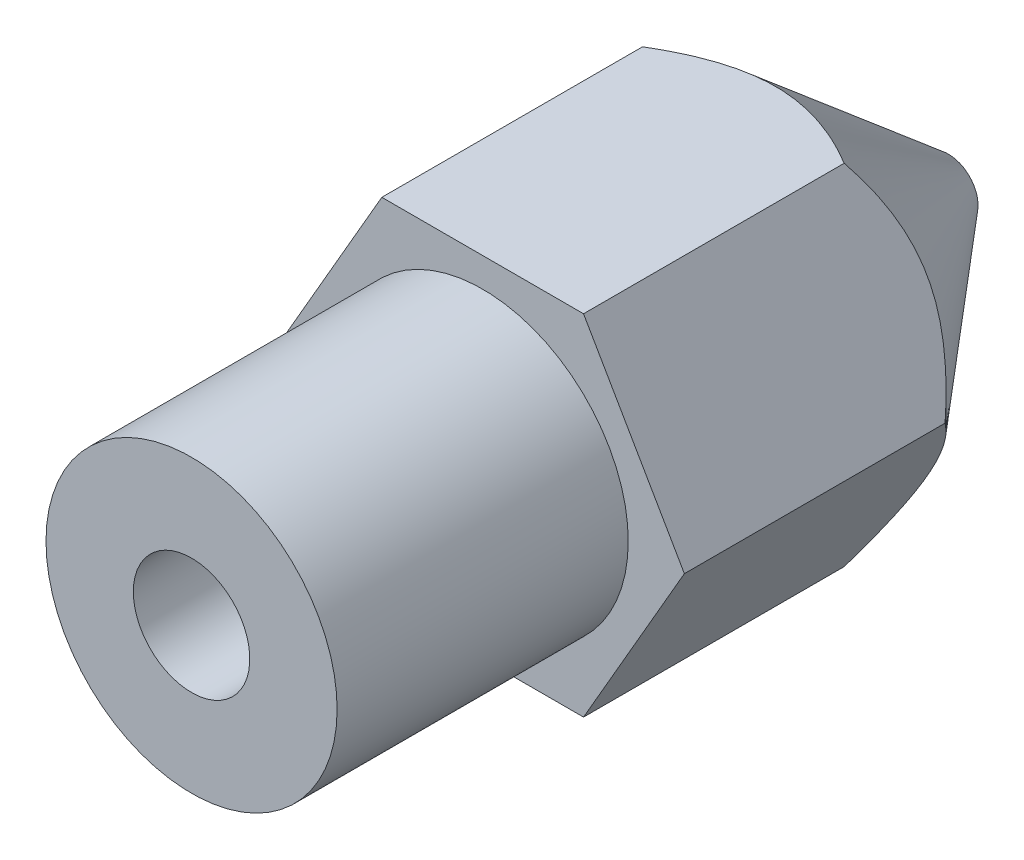
ISO-10303-21;
HEADER;
FILE_DESCRIPTION(('STEP AP214'),'2;1');
FILE_NAME('part.step','',(''),(''),'','','');
FILE_SCHEMA(('AUTOMOTIVE_DESIGN { 1 0 10303 214 1 1 1 1 }'));
ENDSEC;
DATA;
#1=APPLICATION_CONTEXT('core data for automotive mechanical design processes');
#2=APPLICATION_PROTOCOL_DEFINITION('international standard','automotive_design',2000,#1);
#3=PRODUCT_CONTEXT('',#1,'mechanical');
#4=PRODUCT('Part','Part','',(#3));
#5=PRODUCT_RELATED_PRODUCT_CATEGORY('part','',(#4));
#6=PRODUCT_DEFINITION_FORMATION('','',#4);
#7=PRODUCT_DEFINITION_CONTEXT('part definition',#1,'design');
#8=PRODUCT_DEFINITION('design','',#6,#7);
#9=PRODUCT_DEFINITION_SHAPE('','',#8);
#10=(LENGTH_UNIT() NAMED_UNIT(*) SI_UNIT(.MILLI.,.METRE.));
#11=(NAMED_UNIT(*) PLANE_ANGLE_UNIT() SI_UNIT($,.RADIAN.));
#12=(NAMED_UNIT(*) SI_UNIT($,.STERADIAN.) SOLID_ANGLE_UNIT());
#13=UNCERTAINTY_MEASURE_WITH_UNIT(LENGTH_MEASURE(1.E-05),#10,'distance_accuracy_value','');
#14=(GEOMETRIC_REPRESENTATION_CONTEXT(3) GLOBAL_UNCERTAINTY_ASSIGNED_CONTEXT((#13)) GLOBAL_UNIT_ASSIGNED_CONTEXT((#10,
#11,#12)) REPRESENTATION_CONTEXT('',''));
#15=CARTESIAN_POINT('',(0.,0.,0.));
#16=DIRECTION('',(0.,0.,1.));
#17=DIRECTION('',(1.,0.,0.));
#18=AXIS2_PLACEMENT_3D('',#15,#16,#17);
#19=CARTESIAN_POINT('',(1.73205080756888,3.,8.));
#20=DIRECTION('',(0.,0.,1.));
#21=DIRECTION('',(1.,0.,0.));
#22=AXIS2_PLACEMENT_3D('',#19,#20,#21);
#23=PLANE('',#22);
#24=DIRECTION('',(-0.5,0.866025403784438,0.));
#25=VECTOR('',#24,1.);
#26=CARTESIAN_POINT('',(3.46410161513776,0.,8.));
#27=LINE('',#26,#25);
#28=CARTESIAN_POINT('',(3.46410161513776,0.,8.));
#29=VERTEX_POINT('',#28);
#30=CARTESIAN_POINT('',(1.73205080756888,3.,8.));
#31=VERTEX_POINT('',#30);
#32=EDGE_CURVE('E127',#29,#31,#27,.T.);
#33=ORIENTED_EDGE('',*,*,#32,.T.);
#34=DIRECTION('',(-1.,0.,0.));
#35=VECTOR('',#34,1.);
#36=CARTESIAN_POINT('',(1.73205080756888,3.,8.));
#37=LINE('',#36,#35);
#38=CARTESIAN_POINT('',(-1.73205080756887,3.,8.));
#39=VERTEX_POINT('',#38);
#40=EDGE_CURVE('E125',#31,#39,#37,.T.);
#41=ORIENTED_EDGE('',*,*,#40,.T.);
#42=DIRECTION('',(-0.5,-0.866025403784439,0.));
#43=VECTOR('',#42,1.);
#44=CARTESIAN_POINT('',(-1.73205080756887,3.,8.));
#45=LINE('',#44,#43);
#46=CARTESIAN_POINT('',(-3.46410161513775,0.,8.));
#47=VERTEX_POINT('',#46);
#48=EDGE_CURVE('E123',#39,#47,#45,.T.);
#49=ORIENTED_EDGE('',*,*,#48,.T.);
#50=DIRECTION('',(0.5,-0.866025403784439,0.));
#51=VECTOR('',#50,1.);
#52=CARTESIAN_POINT('',(-3.46410161513775,0.,8.));
#53=LINE('',#52,#51);
#54=CARTESIAN_POINT('',(-1.73205080756886,-3.00000000000001,8.));
#55=VERTEX_POINT('',#54);
#56=EDGE_CURVE('E108',#47,#55,#53,.T.);
#57=ORIENTED_EDGE('',*,*,#56,.T.);
#58=DIRECTION('',(1.,0.,0.));
#59=VECTOR('',#58,1.);
#60=CARTESIAN_POINT('',(-1.73205080756886,-3.00000000000001,8.));
#61=LINE('',#60,#59);
#62=CARTESIAN_POINT('',(1.73205080756888,-3.00000000000001,8.));
#63=VERTEX_POINT('',#62);
#64=EDGE_CURVE('E120',#55,#63,#61,.T.);
#65=ORIENTED_EDGE('',*,*,#64,.T.);
#66=DIRECTION('',(0.500000000000001,0.866025403784438,0.));
#67=VECTOR('',#66,1.);
#68=CARTESIAN_POINT('',(1.73205080756888,-3.00000000000001,8.));
#69=LINE('',#68,#67);
#70=EDGE_CURVE('E56',#63,#29,#69,.T.);
#71=ORIENTED_EDGE('',*,*,#70,.T.);
#72=EDGE_LOOP('',(#33,#41,#49,#57,#65,#71));
#73=FACE_BOUND('',#72,.T.);
#74=CARTESIAN_POINT('',(0.,0.,8.));
#75=DIRECTION('',(0.,0.,1.));
#76=DIRECTION('',(1.,0.,0.));
#77=AXIS2_PLACEMENT_3D('',#74,#75,#76);
#78=CIRCLE('',#77,2.5);
#79=CARTESIAN_POINT('',(2.5,0.,8.));
#80=VERTEX_POINT('',#79);
#81=EDGE_CURVE('E191',#80,#80,#78,.T.);
#82=ORIENTED_EDGE('',*,*,#81,.F.);
#83=EDGE_LOOP('',(#82));
#84=FACE_BOUND('',#83,.T.);
#85=ADVANCED_FACE('F32',(#73,#84),#23,.T.);
#86=CARTESIAN_POINT('',(3.46410161513776,0.,8.));
#87=DIRECTION('',(-0.866025403784439,-0.5,0.));
#88=DIRECTION('',(0.5,-0.866025403784438,0.));
#89=AXIS2_PLACEMENT_3D('',#86,#87,#88);
#90=PLANE('',#89);
#91=DIRECTION('',(0.,0.,-1.));
#92=VECTOR('',#91,1.);
#93=CARTESIAN_POINT('',(3.46410161513776,0.,8.));
#94=LINE('',#93,#92);
#95=CARTESIAN_POINT('',(3.46410161513776,0.,3.52294471991393));
#96=VERTEX_POINT('',#95);
#97=EDGE_CURVE('E116',#29,#96,#94,.T.);
#98=ORIENTED_EDGE('',*,*,#97,.T.);
#99=CARTESIAN_POINT('',(3.4642170851916,-0.000200000000002073,3.52308233864579));
#100=CARTESIAN_POINT('',(3.43869463133359,0.044006186815907,3.49266746581305));
#101=CARTESIAN_POINT('',(3.41295293207215,0.0885921178098782,3.46299012878402));
#102=CARTESIAN_POINT('',(3.36098419646129,0.178604608293004,3.40532994787256));
#103=CARTESIAN_POINT('',(3.33475693638822,0.224031555282886,3.37734791182005));
#104=CARTESIAN_POINT('',(3.25499359828184,0.362185709464426,3.29599071067637));
#105=CARTESIAN_POINT('',(3.20068305622264,0.456254327697571,3.2455772347749));
#106=CARTESIAN_POINT('',(3.08974804739879,0.648399399318572,3.15495945221523));
#107=CARTESIAN_POINT('',(3.03311706731516,0.746487134105849,3.11478654613717));
#108=CARTESIAN_POINT('',(2.91800413275103,0.945868585379263,3.0478620065605));
#109=CARTESIAN_POINT('',(2.85952763655758,1.04715284783493,3.02107413593327));
#110=CARTESIAN_POINT('',(2.76274665520783,1.21478242473907,2.99022362889044));
#111=CARTESIAN_POINT('',(2.72481140282983,1.28048820925571,2.98144357428769));
#112=CARTESIAN_POINT('',(2.64868595221972,1.41234135746151,2.97073947198294));
#113=CARTESIAN_POINT('',(2.61049571152768,1.4784887946934,2.96881659616188));
#114=CARTESIAN_POINT('',(2.53439457612267,1.61029982772856,2.97192711595301));
#115=CARTESIAN_POINT('',(2.49648328784379,1.67596410520797,2.97692293752085));
#116=CARTESIAN_POINT('',(2.42103119270349,1.80665096752849,2.99355296421294));
#117=CARTESIAN_POINT('',(2.38349040443597,1.87167352016402,3.00518750080136));
#118=CARTESIAN_POINT('',(2.29864842657643,2.01862413643138,3.03867023746345));
#119=CARTESIAN_POINT('',(2.25153882782097,2.10022035500002,3.06245991001242));
#120=CARTESIAN_POINT('',(2.15861011531844,2.26117760653636,3.11858927441615));
#121=CARTESIAN_POINT('',(2.11279172218847,2.34053739135863,3.15093363999057));
#122=CARTESIAN_POINT('',(2.02238302037588,2.49712985634438,3.22277041242338));
#123=CARTESIAN_POINT('',(1.97779839516253,2.57435269245033,3.26229105813821));
#124=CARTESIAN_POINT('',(1.89002415817496,2.72638213050838,3.34699247455188));
#125=CARTESIAN_POINT('',(1.84683408162059,2.80118953748334,3.39217133444989));
#126=CARTESIAN_POINT('',(1.79210671691308,2.89598011372109,3.4531856764344));
#127=CARTESIAN_POINT('',(1.77998057370403,2.91698320985903,3.46694840307263));
#128=CARTESIAN_POINT('',(1.7558656184871,2.95875153751699,3.49478107972986));
#129=CARTESIAN_POINT('',(1.74387650192764,2.97951729653585,3.50884997393238));
#130=CARTESIAN_POINT('',(1.73193533751504,3.0002,3.52308233864578));
#131=B_SPLINE_CURVE_WITH_KNOTS('',3,(#99,#100,#101,#102,#103,#104,#105,#106,#107,#108,#109,#110,
#111,#112,#113,#114,#115,#116,#117,#118,#119,#120,#121,#122,#123,#124,#125,#126,#127,#128,#129,
#130),.UNSPECIFIED.,.F.,.F.,(4,2,2,2,2,2,2,2,2,2,2,2,2,2,2,4),(0.,0.178245629302809,
0.356575537225754,0.715386164685095,1.07528412335111,1.43420238315129,1.66305462105009,
1.89194596755864,2.11959911436331,2.34726362864904,2.63829419086161,2.9294840825832,
3.22184567494964,3.51410880056233,3.59776317254748,3.68116437690592),.UNSPECIFIED.);
#132=CARTESIAN_POINT('',(1.73205080756887,3.,3.52294471991392));
#133=VERTEX_POINT('',#132);
#134=EDGE_CURVE('E48',#96,#133,#131,.T.);
#135=ORIENTED_EDGE('',*,*,#134,.T.);
#136=DIRECTION('',(0.,0.,-1.));
#137=VECTOR('',#136,1.);
#138=CARTESIAN_POINT('',(1.73205080756888,3.,8.));
#139=LINE('',#138,#137);
#140=EDGE_CURVE('E11',#31,#133,#139,.T.);
#141=ORIENTED_EDGE('',*,*,#140,.F.);
#142=ORIENTED_EDGE('',*,*,#32,.F.);
#143=EDGE_LOOP('',(#98,#135,#141,#142));
#144=FACE_BOUND('',#143,.T.);
#145=ADVANCED_FACE('F34',(#144),#90,.F.);
#146=CARTESIAN_POINT('',(1.73205080756888,3.,8.));
#147=DIRECTION('',(0.,-1.,0.));
#148=DIRECTION('',(1.,0.,0.));
#149=AXIS2_PLACEMENT_3D('',#146,#147,#148);
#150=PLANE('',#149);
#151=ORIENTED_EDGE('',*,*,#140,.T.);
#152=CARTESIAN_POINT('',(-3.22295574119933,3.,4.64202027297319));
#153=CARTESIAN_POINT('',(-3.14866456999353,3.,4.57722804217128));
#154=CARTESIAN_POINT('',(-3.07386720617369,3.,4.51300704367201));
#155=CARTESIAN_POINT('',(-2.92306901743919,3.,4.38595436096668));
#156=CARTESIAN_POINT('',(-2.84706787866033,3.,4.32312304968304));
#157=CARTESIAN_POINT('',(-2.6930741662895,3.,4.19861692408729));
#158=CARTESIAN_POINT('',(-2.6150703025345,3.,4.13695602802997));
#159=CARTESIAN_POINT('',(-2.45747763696054,3.,4.01570088403585));
#160=CARTESIAN_POINT('',(-2.37788895737681,3.,3.95610647767728));
#161=CARTESIAN_POINT('',(-2.21226319105369,3.,3.83609652066978));
#162=CARTESIAN_POINT('',(-2.12611791459268,3.,3.7758295645937));
#163=CARTESIAN_POINT('',(-1.95146092484071,3.,3.65883313971423));
#164=CARTESIAN_POINT('',(-1.862949542762,3.,3.60210317946147));
#165=CARTESIAN_POINT('',(-1.68348763932878,3.,3.4932828077357));
#166=CARTESIAN_POINT('',(-1.59254582378486,3.,3.44117813886258));
#167=CARTESIAN_POINT('',(-1.40766080199472,3.,3.34263647515716));
#168=CARTESIAN_POINT('',(-1.31371907965324,3.,3.29619673132752));
#169=CARTESIAN_POINT('',(-1.14160314144222,3.,3.21902874651616));
#170=CARTESIAN_POINT('',(-1.06400939113508,3.,3.18701272237732));
#171=CARTESIAN_POINT('',(-0.906724146240844,3.,3.12852036416766));
#172=CARTESIAN_POINT('',(-0.827032343434775,3.,3.10204484920775));
#173=CARTESIAN_POINT('',(-0.666765879501368,3.,3.05593321525947));
#174=CARTESIAN_POINT('',(-0.586215264979745,3.,3.03621454688705));
#175=CARTESIAN_POINT('',(-0.423677569835856,3.,3.00406546148636));
#176=CARTESIAN_POINT('',(-0.341690912472178,3.,2.99163293296945));
#177=CARTESIAN_POINT('',(-0.170833955379293,3.,2.97410376642416));
#178=CARTESIAN_POINT('',(-0.081899881508962,3.,2.96961216728269));
#179=CARTESIAN_POINT('',(0.0959382202663701,3.,2.97010731024863));
#180=CARTESIAN_POINT('',(0.184842248422883,3.,2.97509397094441));
#181=CARTESIAN_POINT('',(0.362012210074435,3.,2.99424396702937));
#182=CARTESIAN_POINT('',(0.450273974736166,3.,3.008445230595));
#183=CARTESIAN_POINT('',(0.625037049591489,3.,3.04518186386427));
#184=CARTESIAN_POINT('',(0.711537856285206,3.,3.0677195828073));
#185=CARTESIAN_POINT('',(0.906806863060719,3.,3.12746451851919));
#186=CARTESIAN_POINT('',(1.01485012910351,3.,3.16702487948031));
#187=CARTESIAN_POINT('',(1.22700018854276,3.,3.25550899766203));
#188=CARTESIAN_POINT('',(1.33110512896763,3.,3.30443709834455));
#189=CARTESIAN_POINT('',(1.53668430931268,3.,3.41005633377597));
#190=CARTESIAN_POINT('',(1.63811800420944,3.,3.46682558947844));
#191=CARTESIAN_POINT('',(1.78769617855274,3.,3.55618235432926));
#192=CARTESIAN_POINT('',(1.83712085888778,3.,3.58666437322881));
#193=CARTESIAN_POINT('',(1.93518306945462,3.,3.64886752185651));
#194=CARTESIAN_POINT('',(1.98382062456063,3.,3.68058861231978));
#195=CARTESIAN_POINT('',(2.13378122447039,3.,3.78081247615568));
#196=CARTESIAN_POINT('',(2.23385896550754,3.,3.851181098436));
#197=CARTESIAN_POINT('',(2.43131325852487,3.,3.99562498821137));
#198=CARTESIAN_POINT('',(2.52868918410549,3.,4.06970110428759));
#199=CARTESIAN_POINT('',(2.72123724273939,3.,4.2208053537262));
#200=CARTESIAN_POINT('',(2.81640761386768,3.,4.29783572498653));
#201=CARTESIAN_POINT('',(3.00483468764952,3.,4.45420749565083));
#202=CARTESIAN_POINT('',(3.09809124393098,3.,4.53354907070542));
#203=CARTESIAN_POINT('',(3.37615401007069,3.,4.77495220734156));
#204=CARTESIAN_POINT('',(3.5585288907299,3.,4.93981242520527));
#205=CARTESIAN_POINT('',(3.91862473386716,3.,5.27453714461536));
#206=CARTESIAN_POINT('',(4.09634508450222,3.,5.44440229789129));
#207=CARTESIAN_POINT('',(4.43063619732703,3.,5.77044631290848));
#208=CARTESIAN_POINT('',(4.58753842906829,3.,5.92628630865772));
#209=CARTESIAN_POINT('',(4.89916516355017,3.,6.24016261867498));
#210=CARTESIAN_POINT('',(5.05388938823812,3.,6.39819920834106));
#211=CARTESIAN_POINT('',(5.36022996871044,3.,6.71454265677976));
#212=CARTESIAN_POINT('',(5.5118617240609,3.,6.8728346333062));
#213=CARTESIAN_POINT('',(5.81369784822192,3.,7.19071526422318));
#214=CARTESIAN_POINT('',(5.96390249245443,3.,7.35030365691423));
#215=CARTESIAN_POINT('',(6.11356459366909,3.,7.51039369391371));
#216=B_SPLINE_CURVE_WITH_KNOTS('',3,(#152,#153,#154,#155,#156,#157,#158,#159,#160,#161,#162,
#163,#164,#165,#166,#167,#168,#169,#170,#171,#172,#173,#174,#175,#176,#177,#178,#179,#180,#181,
#182,#183,#184,#185,#186,#187,#188,#189,#190,#191,#192,#193,#194,#195,#196,#197,#198,#199,#200,
#201,#202,#203,#204,#205,#206,#207,#208,#209,#210,#211,#212,#213,#214,#215),.UNSPECIFIED.,.F.,
.F.,(4,2,2,2,2,2,2,2,2,2,2,2,2,2,2,2,2,2,2,2,2,2,2,2,2,2,2,2,2,2,2,4),(0.,0.295733750989601,
0.591545922160253,0.889812107770324,1.18805537684196,1.50338701340104,1.81867473798144,
2.13295414941823,2.44708043976783,2.69872447515397,2.9504056874458,3.19889220968966,
3.4473066860691,3.7139440335252,3.9805790907629,4.24831866545822,4.5161337475629,
4.86072061856951,5.20546764993026,5.55393728913328,5.72812881431264,5.90231482401513,
6.26921477802517,6.63619909658295,7.0034671265077,7.37076314186513,8.10813640013325,
8.84560610530451,9.50900851923961,10.172494871278,10.8300850723618,11.4875456745734),.UNSPECIFIED.);
#217=CARTESIAN_POINT('',(-1.73205080756888,2.99999999999999,3.52294471991392));
#218=VERTEX_POINT('',#217);
#219=EDGE_CURVE('E105',#133,#218,#216,.F.);
#220=ORIENTED_EDGE('',*,*,#219,.T.);
#221=DIRECTION('',(0.,0.,-1.));
#222=VECTOR('',#221,1.);
#223=CARTESIAN_POINT('',(-1.73205080756887,3.,8.));
#224=LINE('',#223,#222);
#225=EDGE_CURVE('E41',#39,#218,#224,.T.);
#226=ORIENTED_EDGE('',*,*,#225,.F.);
#227=ORIENTED_EDGE('',*,*,#40,.F.);
#228=EDGE_LOOP('',(#151,#220,#226,#227));
#229=FACE_BOUND('',#228,.T.);
#230=ADVANCED_FACE('F174',(#229),#150,.F.);
#231=CARTESIAN_POINT('',(-1.73205080756887,3.,8.));
#232=DIRECTION('',(0.866025403784439,-0.5,0.));
#233=DIRECTION('',(0.5,0.866025403784439,0.));
#234=AXIS2_PLACEMENT_3D('',#231,#232,#233);
#235=PLANE('',#234);
#236=ORIENTED_EDGE('',*,*,#225,.T.);
#237=CARTESIAN_POINT('',(-1.73193533751503,3.0002,3.52308233864578));
#238=CARTESIAN_POINT('',(-1.75745779137305,2.95599381318409,3.49266746581304));
#239=CARTESIAN_POINT('',(-1.78319949063449,2.91140788219012,3.46299012878401));
#240=CARTESIAN_POINT('',(-1.83516822624535,2.82139539170699,3.40532994787255));
#241=CARTESIAN_POINT('',(-1.86139548631842,2.77596844471711,3.37734791182004));
#242=CARTESIAN_POINT('',(-1.9411588244248,2.63781429053557,3.29599071067636));
#243=CARTESIAN_POINT('',(-1.995469366484,2.54374567230243,3.24557723477489));
#244=CARTESIAN_POINT('',(-2.10640437530784,2.35160060068143,3.15495945221523));
#245=CARTESIAN_POINT('',(-2.16303535539148,2.25351286589415,3.11478654613716));
#246=CARTESIAN_POINT('',(-2.2781482899556,2.05413141462073,3.0478620065605));
#247=CARTESIAN_POINT('',(-2.33662478614905,1.95284715216507,3.02107413593326));
#248=CARTESIAN_POINT('',(-2.4334057674988,1.78521757526093,2.99022362889044));
#249=CARTESIAN_POINT('',(-2.4713410198768,1.71951179074429,2.98144357428769));
#250=CARTESIAN_POINT('',(-2.54746647048692,1.58765864253849,2.97073947198293));
#251=CARTESIAN_POINT('',(-2.58565671117895,1.5215112053066,2.96881659616188));
#252=CARTESIAN_POINT('',(-2.66175784658396,1.38970017227144,2.971927115953));
#253=CARTESIAN_POINT('',(-2.69966913486284,1.32403589479203,2.97692293752084));
#254=CARTESIAN_POINT('',(-2.77512123000314,1.19334903247151,2.99355296421293));
#255=CARTESIAN_POINT('',(-2.81266201827066,1.12832647983598,3.00518750080135));
#256=CARTESIAN_POINT('',(-2.8975039961302,0.981375863568623,3.03867023746345));
#257=CARTESIAN_POINT('',(-2.94461359488566,0.899779644999983,3.06245991001242));
#258=CARTESIAN_POINT('',(-3.03754230738819,0.738822393463644,3.11858927441614));
#259=CARTESIAN_POINT('',(-3.08336070051816,0.659462608641371,3.15093363999057));
#260=CARTESIAN_POINT('',(-3.17376940233075,0.502870143655624,3.22277041242337));
#261=CARTESIAN_POINT('',(-3.2183540275441,0.425647307549675,3.2622910581382));
#262=CARTESIAN_POINT('',(-3.30612826453167,0.273617869491621,3.34699247455187));
#263=CARTESIAN_POINT('',(-3.34931834108604,0.198810462516665,3.39217133444988));
#264=CARTESIAN_POINT('',(-3.40404570579355,0.104019886278909,3.4531856764344));
#265=CARTESIAN_POINT('',(-3.4161718490026,0.0830167901409694,3.46694840307262));
#266=CARTESIAN_POINT('',(-3.44028680421952,0.0412484624830093,3.49478107972985));
#267=CARTESIAN_POINT('',(-3.45227592077899,0.0204827034641519,3.50884997393238));
#268=CARTESIAN_POINT('',(-3.46421708519158,-0.000199999999998438,3.52308233864578));
#269=B_SPLINE_CURVE_WITH_KNOTS('',3,(#237,#238,#239,#240,#241,#242,#243,#244,#245,#246,#247,
#248,#249,#250,#251,#252,#253,#254,#255,#256,#257,#258,#259,#260,#261,#262,#263,#264,#265,#266,
#267,#268),.UNSPECIFIED.,.F.,.F.,(4,2,2,2,2,2,2,2,2,2,2,2,2,2,2,4),(0.,0.178245629302809,
0.356575537225753,0.715386164685093,1.07528412335111,1.43420238315128,1.66305462105009,
1.89194596755864,2.1195991143633,2.34726362864903,2.6382941908616,2.92948408258319,
3.22184567494963,3.51410880056232,3.59776317254747,3.68116437690592),.UNSPECIFIED.);
#270=CARTESIAN_POINT('',(-3.46410161513775,0.,3.52294471991392));
#271=VERTEX_POINT('',#270);
#272=EDGE_CURVE('E88',#218,#271,#269,.T.);
#273=ORIENTED_EDGE('',*,*,#272,.T.);
#274=DIRECTION('',(0.,0.,-1.));
#275=VECTOR('',#274,1.);
#276=CARTESIAN_POINT('',(-3.46410161513775,0.,8.));
#277=LINE('',#276,#275);
#278=EDGE_CURVE('E102',#47,#271,#277,.T.);
#279=ORIENTED_EDGE('',*,*,#278,.F.);
#280=ORIENTED_EDGE('',*,*,#48,.F.);
#281=EDGE_LOOP('',(#236,#273,#279,#280));
#282=FACE_BOUND('',#281,.T.);
#283=ADVANCED_FACE('F100',(#282),#235,.F.);
#284=CARTESIAN_POINT('',(-3.46410161513775,0.,8.));
#285=DIRECTION('',(0.866025403784439,0.5,0.));
#286=DIRECTION('',(-0.5,0.866025403784439,0.));
#287=AXIS2_PLACEMENT_3D('',#284,#285,#286);
#288=PLANE('',#287);
#289=ORIENTED_EDGE('',*,*,#278,.T.);
#290=CARTESIAN_POINT('',(-3.46421708519158,0.000200000000001525,3.52308233864578));
#291=CARTESIAN_POINT('',(-3.43869463133357,-0.0440061868159076,3.49266746581304));
#292=CARTESIAN_POINT('',(-3.41295293207213,-0.0885921178098788,3.46299012878401));
#293=CARTESIAN_POINT('',(-3.36098419646127,-0.178604608293005,3.40532994787255));
#294=CARTESIAN_POINT('',(-3.3347569363882,-0.224031555282886,3.37734791182004));
#295=CARTESIAN_POINT('',(-3.25499359828182,-0.362185709464425,3.29599071067636));
#296=CARTESIAN_POINT('',(-3.20068305622262,-0.45625432769757,3.24557723477489));
#297=CARTESIAN_POINT('',(-3.08974804739878,-0.648399399318569,3.15495945221522));
#298=CARTESIAN_POINT('',(-3.03311706731514,-0.746487134105846,3.11478654613716));
#299=CARTESIAN_POINT('',(-2.91800413275102,-0.94586858537926,3.0478620065605));
#300=CARTESIAN_POINT('',(-2.85952763655757,-1.04715284783492,3.02107413593326));
#301=CARTESIAN_POINT('',(-2.76274665520782,-1.21478242473907,2.99022362889044));
#302=CARTESIAN_POINT('',(-2.72481140282982,-1.28048820925571,2.98144357428768));
#303=CARTESIAN_POINT('',(-2.6486859522197,-1.41234135746151,2.97073947198293));
#304=CARTESIAN_POINT('',(-2.61049571152767,-1.47848879469339,2.96881659616188));
#305=CARTESIAN_POINT('',(-2.53439457612266,-1.61029982772856,2.971927115953));
#306=CARTESIAN_POINT('',(-2.49648328784378,-1.67596410520796,2.97692293752084));
#307=CARTESIAN_POINT('',(-2.42103119270348,-1.80665096752848,2.99355296421293));
#308=CARTESIAN_POINT('',(-2.38349040443596,-1.87167352016402,3.00518750080135));
#309=CARTESIAN_POINT('',(-2.29864842657642,-2.01862413643137,3.03867023746345));
#310=CARTESIAN_POINT('',(-2.25153882782096,-2.10022035500001,3.06245991001241));
#311=CARTESIAN_POINT('',(-2.15861011531843,-2.26117760653635,3.11858927441614));
#312=CARTESIAN_POINT('',(-2.11279172218846,-2.34053739135862,3.15093363999057));
#313=CARTESIAN_POINT('',(-2.02238302037587,-2.49712985634437,3.22277041242337));
#314=CARTESIAN_POINT('',(-1.97779839516252,-2.57435269245032,3.2622910581382));
#315=CARTESIAN_POINT('',(-1.89002415817495,-2.72638213050837,3.34699247455187));
#316=CARTESIAN_POINT('',(-1.84683408162058,-2.80118953748333,3.39217133444988));
#317=CARTESIAN_POINT('',(-1.79210671691307,-2.89598011372109,3.4531856764344));
#318=CARTESIAN_POINT('',(-1.77998057370402,-2.91698320985903,3.46694840307263));
#319=CARTESIAN_POINT('',(-1.75586561848709,-2.958751537517,3.49478107972986));
#320=CARTESIAN_POINT('',(-1.74387650192762,-2.97951729653586,3.50884997393239));
#321=CARTESIAN_POINT('',(-1.73193533751503,-3.00020000000001,3.52308233864579));
#322=B_SPLINE_CURVE_WITH_KNOTS('',3,(#290,#291,#292,#293,#294,#295,#296,#297,#298,#299,#300,
#301,#302,#303,#304,#305,#306,#307,#308,#309,#310,#311,#312,#313,#314,#315,#316,#317,#318,#319,
#320,#321),.UNSPECIFIED.,.F.,.F.,(4,2,2,2,2,2,2,2,2,2,2,2,2,2,2,4),(0.,0.178245629302809,
0.356575537225752,0.715386164685092,1.07528412335111,1.43420238315128,1.66305462105009,
1.89194596755863,2.1195991143633,2.34726362864903,2.63829419086159,2.92948408258318,
3.22184567494963,3.51410880056232,3.59776317254748,3.68116437690594),.UNSPECIFIED.);
#323=CARTESIAN_POINT('',(-1.73205080756885,-3.00000000000001,3.52294471991392));
#324=VERTEX_POINT('',#323);
#325=EDGE_CURVE('E85',#271,#324,#322,.T.);
#326=ORIENTED_EDGE('',*,*,#325,.T.);
#327=DIRECTION('',(0.,0.,-1.));
#328=VECTOR('',#327,1.);
#329=CARTESIAN_POINT('',(-1.73205080756886,-3.00000000000001,8.));
#330=LINE('',#329,#328);
#331=EDGE_CURVE('E109',#55,#324,#330,.T.);
#332=ORIENTED_EDGE('',*,*,#331,.F.);
#333=ORIENTED_EDGE('',*,*,#56,.F.);
#334=EDGE_LOOP('',(#289,#326,#332,#333));
#335=FACE_BOUND('',#334,.T.);
#336=ADVANCED_FACE('F107',(#335),#288,.F.);
#337=CARTESIAN_POINT('',(-1.73205080756886,-3.00000000000001,8.));
#338=DIRECTION('',(0.,1.,0.));
#339=DIRECTION('',(-1.,0.,0.));
#340=AXIS2_PLACEMENT_3D('',#337,#338,#339);
#341=PLANE('',#340);
#342=ORIENTED_EDGE('',*,*,#331,.T.);
#343=CARTESIAN_POINT('',(-3.22295574067235,-3.00000000000001,4.6420202725135));
#344=CARTESIAN_POINT('',(-3.1486645694817,-3.00000000000001,4.57722804172972));
#345=CARTESIAN_POINT('',(-3.07386720567708,-3.00000000000001,4.51300704324853));
#346=CARTESIAN_POINT('',(-2.92306901697324,-3.00000000000001,4.38595436057924));
#347=CARTESIAN_POINT('',(-2.84706787820982,-3.00000000000001,4.32312304931355));
#348=CARTESIAN_POINT('',(-2.69307416587049,-3.00000000000001,4.19861692375382));
#349=CARTESIAN_POINT('',(-2.61507030213158,-3.00000000000001,4.13695602771457));
#350=CARTESIAN_POINT('',(-2.45747763659015,-3.00000000000001,4.01570088375627));
#351=CARTESIAN_POINT('',(-2.37788895702288,-3.00000000000001,3.95610647741545));
#352=CARTESIAN_POINT('',(-2.21226319073622,-3.00000000000001,3.83609652044547));
#353=CARTESIAN_POINT('',(-2.12611791429529,-3.00000000000001,3.77582956438907));
#354=CARTESIAN_POINT('',(-1.95146092458435,-3.00000000000001,3.65883313954795));
#355=CARTESIAN_POINT('',(-1.86294954252661,-3.00000000000001,3.60210317931388));
#356=CARTESIAN_POINT('',(-1.68348763913629,-3.00000000000001,3.49328280762385));
#357=CARTESIAN_POINT('',(-1.5925458236143,-3.00000000000001,3.4411781387678));
#358=CARTESIAN_POINT('',(-1.40766080186946,-3.00000000000001,3.34263647509429));
#359=CARTESIAN_POINT('',(-1.31371907955133,-3.00000000000001,3.2961967312795));
#360=CARTESIAN_POINT('',(-1.14160314137621,-3.00000000000001,3.21902874648845));
#361=CARTESIAN_POINT('',(-1.06400939108112,-3.00000000000001,3.18701272235616));
#362=CARTESIAN_POINT('',(-0.90672414621168,-3.00000000000001,3.12852036415794));
#363=CARTESIAN_POINT('',(-0.827032343418365,-3.00000000000001,3.10204484920295));
#364=CARTESIAN_POINT('',(-0.666765879510591,-3.00000000000001,3.05593321526223));
#365=CARTESIAN_POINT('',(-0.586215265001833,-3.00000000000001,3.03621454689252));
#366=CARTESIAN_POINT('',(-0.423677569884052,-3.00000000000001,3.00406546149482));
#367=CARTESIAN_POINT('',(-0.341690912533618,-3.00000000000001,2.99163293297819));
#368=CARTESIAN_POINT('',(-0.170833955440274,-3.00000000000001,2.97410376642784));
#369=CARTESIAN_POINT('',(-0.0818998815559374,-3.00000000000001,2.96961216728373));
#370=CARTESIAN_POINT('',(0.0959382202475272,-3.00000000000001,2.97010731024743));
#371=CARTESIAN_POINT('',(0.184842248418167,-3.00000000000001,2.97509397094359));
#372=CARTESIAN_POINT('',(0.362012210097762,-3.00000000000001,2.99424396703223));
#373=CARTESIAN_POINT('',(0.450273974773407,-3.00000000000001,3.00844523060116));
#374=CARTESIAN_POINT('',(0.625037049655875,-3.00000000000001,3.0451818638795));
#375=CARTESIAN_POINT('',(0.711537856362823,-3.00000000000001,3.06771958282829));
#376=CARTESIAN_POINT('',(0.906806863156868,-3.00000000000001,3.12746451855218));
#377=CARTESIAN_POINT('',(1.01485012920505,-3.00000000000001,3.16702487951898));
#378=CARTESIAN_POINT('',(1.2270001886546,-3.00000000000001,3.25550899771239));
#379=CARTESIAN_POINT('',(1.33110512908438,-3.00000000000001,3.30443709840091));
#380=CARTESIAN_POINT('',(1.53668430943894,-3.00000000000001,3.41005633384451));
#381=CARTESIAN_POINT('',(1.63811800434029,-3.00000000000001,3.46682558955314));
#382=CARTESIAN_POINT('',(1.78769617869035,-3.00000000000001,3.55618235441321));
#383=CARTESIAN_POINT('',(1.83712085902762,-3.00000000000001,3.58666437331584));
#384=CARTESIAN_POINT('',(1.93518306959887,-3.00000000000001,3.6488675219497));
#385=CARTESIAN_POINT('',(1.98382062470707,-3.00000000000001,3.68058861241604));
#386=CARTESIAN_POINT('',(2.13378122463265,-3.00000000000001,3.78081247626755));
#387=CARTESIAN_POINT('',(2.2338589656831,-3.00000000000001,3.85118109856079));
#388=CARTESIAN_POINT('',(2.43131325872653,-3.00000000000001,3.99562498836253));
#389=CARTESIAN_POINT('',(2.52868918431994,-3.00000000000001,4.06970110445219));
#390=CARTESIAN_POINT('',(2.72123724297909,-3.00000000000001,4.22080535391802));
#391=CARTESIAN_POINT('',(2.81640761411983,-3.00000000000001,4.29783572519213));
#392=CARTESIAN_POINT('',(3.00483468792629,-3.00000000000001,4.45420749588418));
#393=CARTESIAN_POINT('',(3.09809124421993,-3.00000000000001,4.53354907095275));
#394=CARTESIAN_POINT('',(3.376154010396,-3.00000000000001,4.77495220763114));
#395=CARTESIAN_POINT('',(3.5585288910791,-3.00000000000001,4.93981242552332));
#396=CARTESIAN_POINT('',(3.91862473426377,-3.00000000000001,5.27453714499056));
#397=CARTESIAN_POINT('',(4.09634508492234,-3.00000000000001,5.44440229829516));
#398=CARTESIAN_POINT('',(4.43063619778992,-3.00000000000001,5.77044631336524));
#399=CARTESIAN_POINT('',(4.58753842955048,-3.00000000000001,5.92628630913865));
#400=CARTESIAN_POINT('',(4.89916516407092,-3.00000000000001,6.24016261920424));
#401=CARTESIAN_POINT('',(5.05388938877814,-3.00000000000001,6.39819920889446));
#402=CARTESIAN_POINT('',(5.36022996928884,-3.00000000000001,6.71454265738126));
#403=CARTESIAN_POINT('',(5.51186172465841,-3.00000000000001,6.87283463393166));
#404=CARTESIAN_POINT('',(5.81369784885768,-3.00000000000001,7.19071526489649));
#405=CARTESIAN_POINT('',(5.96390249310932,-3.00000000000001,7.35030365761146));
#406=CARTESIAN_POINT('',(6.1135645943431,-3.00000000000001,7.51039369463483));
#407=B_SPLINE_CURVE_WITH_KNOTS('',3,(#343,#344,#345,#346,#347,#348,#349,#350,#351,#352,#353,
#354,#355,#356,#357,#358,#359,#360,#361,#362,#363,#364,#365,#366,#367,#368,#369,#370,#371,#372,
#373,#374,#375,#376,#377,#378,#379,#380,#381,#382,#383,#384,#385,#386,#387,#388,#389,#390,#391,
#392,#393,#394,#395,#396,#397,#398,#399,#400,#401,#402,#403,#404,#405,#406),.UNSPECIFIED.,.F.,
.F.,(4,2,2,2,2,2,2,2,2,2,2,2,2,2,2,2,2,2,2,2,2,2,2,2,2,2,2,2,2,2,2,4),(0.,0.295733750919617,
0.591545922020261,0.889812107558883,1.18805537655908,1.503387013035,1.81867473753226,
2.13295414888655,2.44708043915378,2.69872447449911,2.9504056867501,3.19889220895468,
3.44730668529493,3.71394403279312,3.98057909007297,4.24831866481088,4.51613374695817,
4.86072061798581,5.20546764936754,5.55393728859163,5.72812881378154,5.90231482349456,
6.26921477755954,6.63619909617227,7.00346712615204,7.37076314156449,8.10813639994305,
8.84560610522476,9.50900851925203,10.1724948713826,10.830085072558,11.4875456748612),.UNSPECIFIED.);
#408=CARTESIAN_POINT('',(1.73205080756889,-2.99999999999999,3.52294471991392));
#409=VERTEX_POINT('',#408);
#410=EDGE_CURVE('E91',#324,#409,#407,.T.);
#411=ORIENTED_EDGE('',*,*,#410,.T.);
#412=DIRECTION('',(0.,0.,-1.));
#413=VECTOR('',#412,1.);
#414=CARTESIAN_POINT('',(1.73205080756888,-3.00000000000001,8.));
#415=LINE('',#414,#413);
#416=EDGE_CURVE('E111',#63,#409,#415,.T.);
#417=ORIENTED_EDGE('',*,*,#416,.F.);
#418=ORIENTED_EDGE('',*,*,#64,.F.);
#419=EDGE_LOOP('',(#342,#411,#417,#418));
#420=FACE_BOUND('',#419,.T.);
#421=ADVANCED_FACE('F208',(#420),#341,.F.);
#422=CARTESIAN_POINT('',(1.73205080756888,-3.00000000000001,8.));
#423=DIRECTION('',(-0.866025403784438,0.500000000000001,0.));
#424=DIRECTION('',(-0.500000000000001,-0.866025403784438,0.));
#425=AXIS2_PLACEMENT_3D('',#422,#423,#424);
#426=PLANE('',#425);
#427=ORIENTED_EDGE('',*,*,#416,.T.);
#428=CARTESIAN_POINT('',(1.73193533751504,-3.00020000000001,3.52308233864579));
#429=CARTESIAN_POINT('',(1.75745779137305,-2.9559938131841,3.49266746581305));
#430=CARTESIAN_POINT('',(1.78319949063449,-2.91140788219013,3.46299012878402));
#431=CARTESIAN_POINT('',(1.83516822624535,-2.821395391707,3.40532994787256));
#432=CARTESIAN_POINT('',(1.86139548631842,-2.77596844471712,3.37734791182005));
#433=CARTESIAN_POINT('',(1.9411588244248,-2.63781429053558,3.29599071067637));
#434=CARTESIAN_POINT('',(1.99546936648401,-2.54374567230243,3.2455772347749));
#435=CARTESIAN_POINT('',(2.10640437530785,-2.35160060068143,3.15495945221523));
#436=CARTESIAN_POINT('',(2.16303535539148,-2.25351286589416,3.11478654613717));
#437=CARTESIAN_POINT('',(2.27814828995561,-2.05413141462074,3.0478620065605));
#438=CARTESIAN_POINT('',(2.33662478614906,-1.95284715216508,3.02107413593327));
#439=CARTESIAN_POINT('',(2.43340576749881,-1.78521757526093,2.99022362889045));
#440=CARTESIAN_POINT('',(2.47134101987681,-1.71951179074429,2.98144357428769));
#441=CARTESIAN_POINT('',(2.54746647048693,-1.58765864253849,2.97073947198294));
#442=CARTESIAN_POINT('',(2.58565671117896,-1.52151120530661,2.96881659616189));
#443=CARTESIAN_POINT('',(2.66175784658398,-1.38970017227144,2.97192711595301));
#444=CARTESIAN_POINT('',(2.69966913486285,-1.32403589479204,2.97692293752085));
#445=CARTESIAN_POINT('',(2.77512123000315,-1.19334903247152,2.99355296421294));
#446=CARTESIAN_POINT('',(2.81266201827067,-1.12832647983598,3.00518750080136));
#447=CARTESIAN_POINT('',(2.89750399613021,-0.981375863568627,3.03867023746346));
#448=CARTESIAN_POINT('',(2.94461359488567,-0.899779644999986,3.06245991001242));
#449=CARTESIAN_POINT('',(3.0375423073882,-0.738822393463646,3.11858927441615));
#450=CARTESIAN_POINT('',(3.08336070051817,-0.659462608641374,3.15093363999058));
#451=CARTESIAN_POINT('',(3.17376940233076,-0.502870143655626,3.22277041242338));
#452=CARTESIAN_POINT('',(3.21835402754412,-0.425647307549677,3.26229105813821));
#453=CARTESIAN_POINT('',(3.30612826453168,-0.273617869491621,3.34699247455188));
#454=CARTESIAN_POINT('',(3.34931834108605,-0.198810462516664,3.39217133444989));
#455=CARTESIAN_POINT('',(3.40404570579356,-0.104019886278909,3.45318567643441));
#456=CARTESIAN_POINT('',(3.41617184900262,-0.0830167901409691,3.46694840307263));
#457=CARTESIAN_POINT('',(3.44028680421954,-0.0412484624830092,3.49478107972986));
#458=CARTESIAN_POINT('',(3.452275920779,-0.020482703464152,3.50884997393239));
#459=CARTESIAN_POINT('',(3.4642170851916,0.000199999999998509,3.52308233864579));
#460=B_SPLINE_CURVE_WITH_KNOTS('',3,(#428,#429,#430,#431,#432,#433,#434,#435,#436,#437,#438,
#439,#440,#441,#442,#443,#444,#445,#446,#447,#448,#449,#450,#451,#452,#453,#454,#455,#456,#457,
#458,#459),.UNSPECIFIED.,.F.,.F.,(4,2,2,2,2,2,2,2,2,2,2,2,2,2,2,4),(0.,0.178245629302809,
0.356575537225753,0.715386164685096,1.07528412335111,1.43420238315129,1.66305462105009,
1.89194596755864,2.11959911436331,2.34726362864904,2.63829419086161,2.9294840825832,
3.22184567494964,3.51410880056234,3.59776317254749,3.68116437690593),.UNSPECIFIED.);
#461=EDGE_CURVE('E150',#409,#96,#460,.T.);
#462=ORIENTED_EDGE('',*,*,#461,.T.);
#463=ORIENTED_EDGE('',*,*,#97,.F.);
#464=ORIENTED_EDGE('',*,*,#70,.F.);
#465=EDGE_LOOP('',(#427,#462,#463,#464));
#466=FACE_BOUND('',#465,.T.);
#467=ADVANCED_FACE('F142',(#466),#426,.F.);
#468=CARTESIAN_POINT('',(0.,0.,3.52294471991392));
#469=DIRECTION('',(0.,0.,1.));
#470=DIRECTION('',(1.,0.,0.));
#471=AXIS2_PLACEMENT_3D('',#468,#469,#470);
#472=CONICAL_SURFACE('',#471,3.46410161513775,0.698131700797738);
#473=CARTESIAN_POINT('',(0.,0.,0.));
#474=DIRECTION('',(0.,0.,-1.));
#475=DIRECTION('',(-1.,0.,0.));
#476=AXIS2_PLACEMENT_3D('',#473,#474,#475);
#477=CIRCLE('',#476,0.508);
#478=CARTESIAN_POINT('',(-0.508,0.,0.));
#479=VERTEX_POINT('',#478);
#480=EDGE_CURVE('E197',#479,#479,#477,.T.);
#481=ORIENTED_EDGE('',*,*,#480,.F.);
#482=EDGE_LOOP('',(#481));
#483=FACE_BOUND('',#482,.T.);
#484=ORIENTED_EDGE('',*,*,#461,.F.);
#485=ORIENTED_EDGE('',*,*,#410,.F.);
#486=ORIENTED_EDGE('',*,*,#325,.F.);
#487=ORIENTED_EDGE('',*,*,#272,.F.);
#488=ORIENTED_EDGE('',*,*,#219,.F.);
#489=ORIENTED_EDGE('',*,*,#134,.F.);
#490=EDGE_LOOP('',(#484,#485,#486,#487,#488,#489));
#491=FACE_BOUND('',#490,.T.);
#492=ADVANCED_FACE('F87',(#483,#491),#472,.T.);
#493=CARTESIAN_POINT('',(1.73205080756888,3.,0.));
#494=DIRECTION('',(0.,0.,1.));
#495=DIRECTION('',(1.,0.,0.));
#496=AXIS2_PLACEMENT_3D('',#493,#494,#495);
#497=PLANE('',#496);
#498=CARTESIAN_POINT('',(0.,0.,0.));
#499=DIRECTION('',(0.,0.,-1.));
#500=DIRECTION('',(-1.,0.,0.));
#501=AXIS2_PLACEMENT_3D('',#498,#499,#500);
#502=CIRCLE('',#501,0.2);
#503=CARTESIAN_POINT('',(-0.2,0.,0.));
#504=VERTEX_POINT('',#503);
#505=EDGE_CURVE('E225',#504,#504,#502,.T.);
#506=ORIENTED_EDGE('',*,*,#505,.F.);
#507=EDGE_LOOP('',(#506));
#508=FACE_BOUND('',#507,.T.);
#509=ORIENTED_EDGE('',*,*,#480,.T.);
#510=EDGE_LOOP('',(#509));
#511=FACE_BOUND('',#510,.T.);
#512=ADVANCED_FACE('F141',(#508,#511),#497,.F.);
#513=CARTESIAN_POINT('',(0.,0.,13.));
#514=DIRECTION('',(0.,0.,-1.));
#515=DIRECTION('',(-1.,0.,0.));
#516=AXIS2_PLACEMENT_3D('',#513,#514,#515);
#517=CYLINDRICAL_SURFACE('',#516,2.5);
#518=CARTESIAN_POINT('',(0.,0.,13.));
#519=DIRECTION('',(0.,0.,1.));
#520=DIRECTION('',(1.,0.,0.));
#521=AXIS2_PLACEMENT_3D('',#518,#519,#520);
#522=CIRCLE('',#521,2.5);
#523=CARTESIAN_POINT('',(2.5,0.,13.));
#524=VERTEX_POINT('',#523);
#525=EDGE_CURVE('E193',#524,#524,#522,.T.);
#526=ORIENTED_EDGE('',*,*,#525,.F.);
#527=EDGE_LOOP('',(#526));
#528=FACE_BOUND('',#527,.T.);
#529=ORIENTED_EDGE('',*,*,#81,.T.);
#530=EDGE_LOOP('',(#529));
#531=FACE_BOUND('',#530,.T.);
#532=ADVANCED_FACE('F144',(#528,#531),#517,.T.);
#533=CARTESIAN_POINT('',(0.,0.,13.));
#534=DIRECTION('',(0.,0.,1.));
#535=DIRECTION('',(1.,0.,0.));
#536=AXIS2_PLACEMENT_3D('',#533,#534,#535);
#537=PLANE('',#536);
#538=CARTESIAN_POINT('',(0.,0.,13.));
#539=DIRECTION('',(0.,0.,-1.));
#540=DIRECTION('',(-1.,0.,0.));
#541=AXIS2_PLACEMENT_3D('',#538,#539,#540);
#542=CIRCLE('',#541,0.999999999999998);
#543=CARTESIAN_POINT('',(-0.999999999999998,0.,13.));
#544=VERTEX_POINT('',#543);
#545=EDGE_CURVE('E194',#544,#544,#542,.T.);
#546=ORIENTED_EDGE('',*,*,#545,.T.);
#547=EDGE_LOOP('',(#546));
#548=FACE_BOUND('',#547,.T.);
#549=ORIENTED_EDGE('',*,*,#525,.T.);
#550=EDGE_LOOP('',(#549));
#551=FACE_BOUND('',#550,.T.);
#552=ADVANCED_FACE('F221',(#548,#551),#537,.T.);
#553=CARTESIAN_POINT('',(0.,0.,0.));
#554=DIRECTION('',(0.,0.,-1.));
#555=DIRECTION('',(-1.,0.,0.));
#556=AXIS2_PLACEMENT_3D('',#553,#554,#555);
#557=CYLINDRICAL_SURFACE('',#556,0.999999999999998);
#558=ORIENTED_EDGE('',*,*,#545,.F.);
#559=EDGE_LOOP('',(#558));
#560=FACE_BOUND('',#559,.T.);
#561=CARTESIAN_POINT('',(0.,0.,1.63825665859564));
#562=DIRECTION('',(0.,0.,-1.));
#563=DIRECTION('',(-1.,0.,0.));
#564=AXIS2_PLACEMENT_3D('',#561,#562,#563);
#565=CIRCLE('',#564,0.999999999999998);
#566=CARTESIAN_POINT('',(0.999999999999999,0.,1.63825665859564));
#567=VERTEX_POINT('',#566);
#568=EDGE_CURVE('E200',#567,#567,#565,.T.);
#569=ORIENTED_EDGE('',*,*,#568,.T.);
#570=EDGE_LOOP('',(#569));
#571=FACE_BOUND('',#570,.T.);
#572=ADVANCED_FACE('F235',(#560,#571),#557,.F.);
#573=CARTESIAN_POINT('',(0.,0.,1.21288911326646));
#574=DIRECTION('',(0.,0.,1.));
#575=DIRECTION('',(1.,0.,0.));
#576=AXIS2_PLACEMENT_3D('',#573,#574,#575);
#577=CONICAL_SURFACE('',#576,0.2,1.08210413623649);
#578=CARTESIAN_POINT('',(0.,0.,1.21288911326646));
#579=DIRECTION('',(0.,0.,-1.));
#580=DIRECTION('',(-1.,0.,0.));
#581=AXIS2_PLACEMENT_3D('',#578,#579,#580);
#582=CIRCLE('',#581,0.2);
#583=CARTESIAN_POINT('',(0.2,0.,1.21288911326646));
#584=VERTEX_POINT('',#583);
#585=EDGE_CURVE('E227',#584,#584,#582,.T.);
#586=CARTESIAN_POINT('',(0.999999999999999,0.,1.63825665859564));
#587=CARTESIAN_POINT('',(0.991666666666665,0.,1.63382574666513));
#588=CARTESIAN_POINT('',(0.983333333333332,0.,1.62939483473462));
#589=CARTESIAN_POINT('',(0.966666666666665,0.,1.62053301087359));
#590=CARTESIAN_POINT('',(0.958333333333332,0.,1.61610209894308));
#591=CARTESIAN_POINT('',(0.941666666666665,0.,1.60724027508206));
#592=CARTESIAN_POINT('',(0.933333333333332,0.,1.60280936315154));
#593=CARTESIAN_POINT('',(0.916666666666665,0.,1.59394753929052));
#594=CARTESIAN_POINT('',(0.908333333333332,0.,1.58951662736001));
#595=CARTESIAN_POINT('',(0.891666666666665,0.,1.58065480349898));
#596=CARTESIAN_POINT('',(0.883333333333332,0.,1.57622389156847));
#597=CARTESIAN_POINT('',(0.866666666666665,0.,1.56736206770744));
#598=CARTESIAN_POINT('',(0.858333333333332,0.,1.56293115577693));
#599=CARTESIAN_POINT('',(0.841666666666666,0.,1.55406933191591));
#600=CARTESIAN_POINT('',(0.833333333333332,0.,1.5496384199854));
#601=CARTESIAN_POINT('',(0.816666666666666,0.,1.54077659612437));
#602=CARTESIAN_POINT('',(0.808333333333332,0.,1.53634568419386));
#603=CARTESIAN_POINT('',(0.791666666666666,0.,1.52748386033283));
#604=CARTESIAN_POINT('',(0.783333333333332,0.,1.52305294840232));
#605=CARTESIAN_POINT('',(0.766666666666666,0.,1.5141911245413));
#606=CARTESIAN_POINT('',(0.758333333333332,0.,1.50976021261079));
#607=CARTESIAN_POINT('',(0.741666666666666,0.,1.50089838874976));
#608=CARTESIAN_POINT('',(0.733333333333333,0.,1.49646747681925));
#609=CARTESIAN_POINT('',(0.716666666666666,0.,1.48760565295822));
#610=CARTESIAN_POINT('',(0.708333333333332,0.,1.48317474102771));
#611=CARTESIAN_POINT('',(0.691666666666666,0.,1.47431291716669));
#612=CARTESIAN_POINT('',(0.683333333333332,0.,1.46988200523617));
#613=CARTESIAN_POINT('',(0.666666666666666,0.,1.46102018137515));
#614=CARTESIAN_POINT('',(0.658333333333333,0.,1.45658926944464));
#615=CARTESIAN_POINT('',(0.641666666666666,0.,1.44772744558361));
#616=CARTESIAN_POINT('',(0.633333333333333,0.,1.4432965336531));
#617=CARTESIAN_POINT('',(0.616666666666666,0.,1.43443470979208));
#618=CARTESIAN_POINT('',(0.608333333333333,0.,1.43000379786156));
#619=CARTESIAN_POINT('',(0.591666666666666,0.,1.42114197400054));
#620=CARTESIAN_POINT('',(0.583333333333333,0.,1.41671106207003));
#621=CARTESIAN_POINT('',(0.566666666666666,0.,1.407849238209));
#622=CARTESIAN_POINT('',(0.558333333333333,0.,1.40341832627849));
#623=CARTESIAN_POINT('',(0.541666666666666,0.,1.39455650241747));
#624=CARTESIAN_POINT('',(0.533333333333333,0.,1.39012559048695));
#625=CARTESIAN_POINT('',(0.516666666666666,0.,1.38126376662593));
#626=CARTESIAN_POINT('',(0.508333333333333,0.,1.37683285469542));
#627=CARTESIAN_POINT('',(0.491666666666666,0.,1.36797103083439));
#628=CARTESIAN_POINT('',(0.483333333333333,0.,1.36354011890388));
#629=CARTESIAN_POINT('',(0.466666666666666,0.,1.35467829504285));
#630=CARTESIAN_POINT('',(0.458333333333333,0.,1.35024738311234));
#631=CARTESIAN_POINT('',(0.441666666666666,0.,1.34138555925132));
#632=CARTESIAN_POINT('',(0.433333333333333,0.,1.33695464732081));
#633=CARTESIAN_POINT('',(0.416666666666666,0.,1.32809282345978));
#634=CARTESIAN_POINT('',(0.408333333333333,0.,1.32366191152927));
#635=CARTESIAN_POINT('',(0.391666666666666,0.,1.31480008766824));
#636=CARTESIAN_POINT('',(0.383333333333333,0.,1.31036917573773));
#637=CARTESIAN_POINT('',(0.366666666666667,0.,1.30150735187671));
#638=CARTESIAN_POINT('',(0.358333333333333,0.,1.2970764399462));
#639=CARTESIAN_POINT('',(0.341666666666667,0.,1.28821461608517));
#640=CARTESIAN_POINT('',(0.333333333333333,0.,1.28378370415466));
#641=CARTESIAN_POINT('',(0.316666666666667,0.,1.27492188029363));
#642=CARTESIAN_POINT('',(0.308333333333333,0.,1.27049096836312));
#643=CARTESIAN_POINT('',(0.291666666666667,0.,1.2616291445021));
#644=CARTESIAN_POINT('',(0.283333333333333,0.,1.25719823257158));
#645=CARTESIAN_POINT('',(0.266666666666667,0.,1.24833640871056));
#646=CARTESIAN_POINT('',(0.258333333333333,0.,1.24390549678005));
#647=CARTESIAN_POINT('',(0.241666666666667,0.,1.23504367291902));
#648=CARTESIAN_POINT('',(0.233333333333334,0.,1.23061276098851));
#649=CARTESIAN_POINT('',(0.216666666666667,0.,1.22175093712749));
#650=CARTESIAN_POINT('',(0.208333333333334,0.,1.21732002519697));
#651=CARTESIAN_POINT('',(0.2,0.,1.21288911326646));
#652=B_SPLINE_CURVE_WITH_KNOTS('',3,(#586,#587,#588,#589,#590,#591,#592,#593,#594,#595,#596,
#597,#598,#599,#600,#601,#602,#603,#604,#605,#606,#607,#608,#609,#610,#611,#612,#613,#614,#615,
#616,#617,#618,#619,#620,#621,#622,#623,#624,#625,#626,#627,#628,#629,#630,#631,#632,#633,#634,
#635,#636,#637,#638,#639,#640,#641,#642,#643,#644,#645,#646,#647,#648,#649,#650,#651),
.UNSPECIFIED.,.F.,.F.,(4,2,2,2,2,2,2,2,2,2,2,2,2,2,2,2,2,2,2,2,2,2,2,2,2,2,2,2,2,2,2,2,4),(0.,
0.0283142512672259,0.0566285025344516,0.0849427538016775,0.113257005068903,0.141571256336129,
0.169885507603355,0.198199758870581,0.226514010137807,0.254828261405033,0.283142512672259,
0.311456763939485,0.339771015206711,0.368085266473936,0.396399517741162,0.424713769008388,
0.453028020275614,0.48134227154284,0.509656522810066,0.537970774077292,0.566285025344518,
0.594599276611743,0.622913527878969,0.651227779146195,0.679542030413421,0.707856281680647,
0.736170532947873,0.764484784215099,0.792799035482325,0.821113286749551,0.849427538016777,
0.877741789284002,0.906056040551228),.UNSPECIFIED.);
#653=EDGE_CURVE('BSEAM237',#567,#584,#652,.T.);
#654=ORIENTED_EDGE('',*,*,#568,.F.);
#655=ORIENTED_EDGE('',*,*,#585,.T.);
#656=ORIENTED_EDGE('',*,*,#653,.T.);
#657=ORIENTED_EDGE('',*,*,#653,.F.);
#658=EDGE_LOOP('',(#654,#656,#655,#657));
#659=FACE_BOUND('',#658,.T.);
#660=ADVANCED_FACE('F237',(#659),#577,.F.);
#661=CARTESIAN_POINT('',(0.,0.,0.));
#662=DIRECTION('',(0.,0.,-1.));
#663=DIRECTION('',(-1.,0.,0.));
#664=AXIS2_PLACEMENT_3D('',#661,#662,#663);
#665=CYLINDRICAL_SURFACE('',#664,0.2);
#666=ORIENTED_EDGE('',*,*,#585,.F.);
#667=EDGE_LOOP('',(#666));
#668=FACE_BOUND('',#667,.T.);
#669=ORIENTED_EDGE('',*,*,#505,.T.);
#670=EDGE_LOOP('',(#669));
#671=FACE_BOUND('',#670,.T.);
#672=ADVANCED_FACE('F240',(#668,#671),#665,.F.);
#673=CLOSED_SHELL('',(#85,#145,#230,#283,#336,#421,#467,#492,#512,#532,#552,#572,#660,#672));
#674=MANIFOLD_SOLID_BREP('B2',#673);
#675=ADVANCED_BREP_SHAPE_REPRESENTATION('',(#18,#674),#14);
#676=SHAPE_DEFINITION_REPRESENTATION(#9,#675);
ENDSEC;
END-ISO-10303-21;
